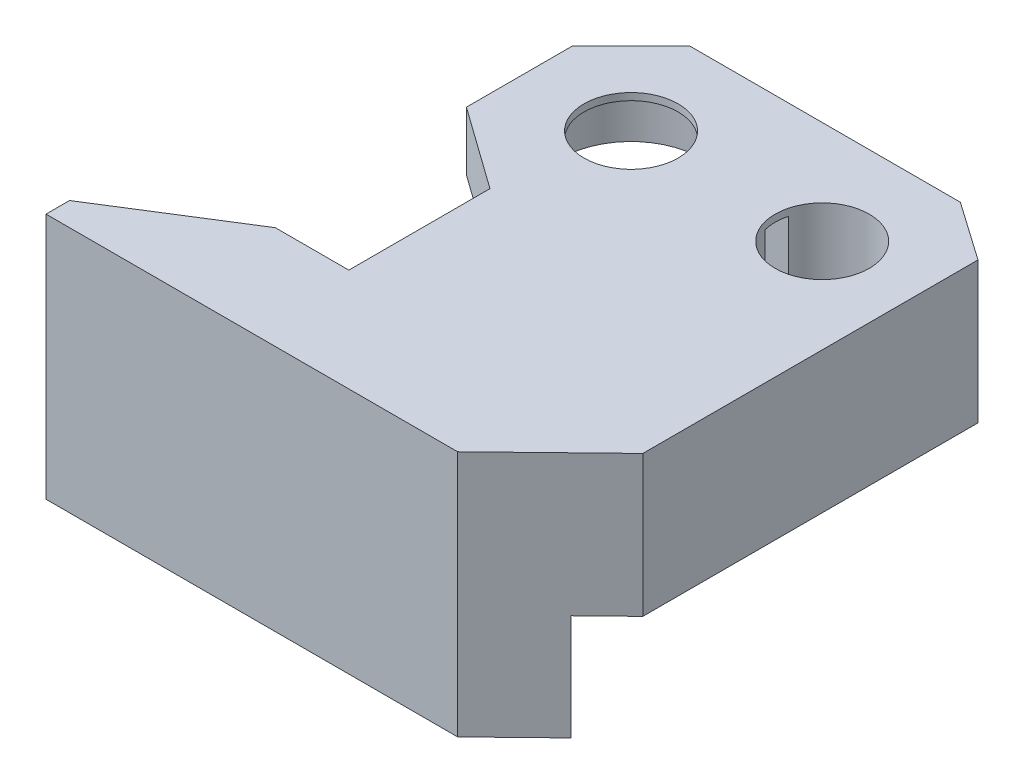
ISO-10303-21;
HEADER;
FILE_DESCRIPTION(('STEP AP214'),'2;1');
FILE_NAME('part.step','',(''),(''),'','','');
FILE_SCHEMA(('AUTOMOTIVE_DESIGN { 1 0 10303 214 1 1 1 1 }'));
ENDSEC;
DATA;
#1=APPLICATION_CONTEXT('core data for automotive mechanical design processes');
#2=APPLICATION_PROTOCOL_DEFINITION('international standard','automotive_design',2000,#1);
#3=PRODUCT_CONTEXT('',#1,'mechanical');
#4=PRODUCT('Part','Part','',(#3));
#5=PRODUCT_RELATED_PRODUCT_CATEGORY('part','',(#4));
#6=PRODUCT_DEFINITION_FORMATION('','',#4);
#7=PRODUCT_DEFINITION_CONTEXT('part definition',#1,'design');
#8=PRODUCT_DEFINITION('design','',#6,#7);
#9=PRODUCT_DEFINITION_SHAPE('','',#8);
#10=(LENGTH_UNIT() NAMED_UNIT(*) SI_UNIT(.MILLI.,.METRE.));
#11=(NAMED_UNIT(*) PLANE_ANGLE_UNIT() SI_UNIT($,.RADIAN.));
#12=(NAMED_UNIT(*) SI_UNIT($,.STERADIAN.) SOLID_ANGLE_UNIT());
#13=UNCERTAINTY_MEASURE_WITH_UNIT(LENGTH_MEASURE(1.E-05),#10,'distance_accuracy_value','');
#14=(GEOMETRIC_REPRESENTATION_CONTEXT(3) GLOBAL_UNCERTAINTY_ASSIGNED_CONTEXT((#13)) GLOBAL_UNIT_ASSIGNED_CONTEXT((#10,
#11,#12)) REPRESENTATION_CONTEXT('',''));
#15=CARTESIAN_POINT('',(0.,0.,0.));
#16=DIRECTION('',(0.,0.,1.));
#17=DIRECTION('',(1.,0.,0.));
#18=AXIS2_PLACEMENT_3D('',#15,#16,#17);
#19=CARTESIAN_POINT('',(16.25,5.,0.));
#20=DIRECTION('',(0.,-1.,0.));
#21=DIRECTION('',(0.,0.,-1.));
#22=AXIS2_PLACEMENT_3D('',#19,#20,#21);
#23=CYLINDRICAL_SURFACE('',#22,4.);
#24=CARTESIAN_POINT('',(16.25,5.,0.));
#25=DIRECTION('',(0.,1.,0.));
#26=DIRECTION('',(0.,0.,1.));
#27=AXIS2_PLACEMENT_3D('',#24,#25,#26);
#28=CIRCLE('',#27,4.);
#29=CARTESIAN_POINT('',(16.25,5.,4.));
#30=VERTEX_POINT('',#29);
#31=EDGE_CURVE('E290',#30,#30,#28,.T.);
#32=ORIENTED_EDGE('',*,*,#31,.T.);
#33=EDGE_LOOP('',(#32));
#34=FACE_BOUND('',#33,.T.);
#35=DIRECTION('',(0.,-1.,0.));
#36=VECTOR('',#35,1.);
#37=CARTESIAN_POINT('',(12.3770166537926,4.4,-1.));
#38=LINE('',#37,#36);
#39=CARTESIAN_POINT('',(12.3770166537926,4.4,-1.));
#40=VERTEX_POINT('',#39);
#41=CARTESIAN_POINT('',(12.3770166537926,-2.5,-1.));
#42=VERTEX_POINT('',#41);
#43=EDGE_CURVE('E209',#40,#42,#38,.T.);
#44=ORIENTED_EDGE('',*,*,#43,.T.);
#45=CARTESIAN_POINT('',(16.25,-2.5,0.));
#46=DIRECTION('',(0.,-1.,0.));
#47=DIRECTION('',(0.,0.,-1.));
#48=AXIS2_PLACEMENT_3D('',#45,#46,#47);
#49=CIRCLE('',#48,4.);
#50=CARTESIAN_POINT('',(12.3770166537926,-2.5,1.));
#51=VERTEX_POINT('',#50);
#52=EDGE_CURVE('E216',#42,#51,#49,.T.);
#53=ORIENTED_EDGE('',*,*,#52,.T.);
#54=DIRECTION('',(0.,-1.,0.));
#55=VECTOR('',#54,1.);
#56=CARTESIAN_POINT('',(12.3770166537926,4.4,1.));
#57=LINE('',#56,#55);
#58=CARTESIAN_POINT('',(12.3770166537926,4.4,1.));
#59=VERTEX_POINT('',#58);
#60=EDGE_CURVE('E198',#59,#51,#57,.T.);
#61=ORIENTED_EDGE('',*,*,#60,.F.);
#62=CARTESIAN_POINT('',(16.25,4.4,0.));
#63=DIRECTION('',(0.,1.,0.));
#64=DIRECTION('',(0.,0.,-1.));
#65=AXIS2_PLACEMENT_3D('',#62,#63,#64);
#66=CIRCLE('',#65,4.);
#67=EDGE_CURVE('E413',#40,#59,#66,.T.);
#68=ORIENTED_EDGE('',*,*,#67,.F.);
#69=EDGE_LOOP('',(#44,#53,#61,#68));
#70=FACE_BOUND('',#69,.T.);
#71=ADVANCED_FACE('F33',(#34,#70),#23,.F.);
#72=CARTESIAN_POINT('',(16.25,-2.5,0.));
#73=DIRECTION('',(0.,-1.,0.));
#74=DIRECTION('',(0.,0.,-1.));
#75=AXIS2_PLACEMENT_3D('',#72,#73,#74);
#76=PLANE('',#75);
#77=ORIENTED_EDGE('',*,*,#52,.F.);
#78=DIRECTION('',(-1.,0.,0.));
#79=VECTOR('',#78,1.);
#80=CARTESIAN_POINT('',(16.25,-2.5,-1.));
#81=LINE('',#80,#79);
#82=CARTESIAN_POINT('',(9.32179676972449,-2.5,-1.));
#83=VERTEX_POINT('',#82);
#84=EDGE_CURVE('E403',#42,#83,#81,.T.);
#85=ORIENTED_EDGE('',*,*,#84,.T.);
#86=CARTESIAN_POINT('',(16.25,-2.5,0.));
#87=DIRECTION('',(0.,-1.,0.));
#88=DIRECTION('',(0.,0.,-1.));
#89=AXIS2_PLACEMENT_3D('',#86,#87,#88);
#90=CIRCLE('',#89,7.);
#91=CARTESIAN_POINT('',(20.880064794363,-2.5,-5.25));
#92=VERTEX_POINT('',#91);
#93=EDGE_CURVE('E231',#83,#92,#90,.T.);
#94=ORIENTED_EDGE('',*,*,#93,.T.);
#95=DIRECTION('',(1.,0.,0.));
#96=VECTOR('',#95,1.);
#97=CARTESIAN_POINT('',(24.25,-2.5,-5.25));
#98=LINE('',#97,#96);
#99=CARTESIAN_POINT('',(20.75,-2.5,-5.25));
#100=VERTEX_POINT('',#99);
#101=EDGE_CURVE('E11',#100,#92,#98,.T.);
#102=ORIENTED_EDGE('',*,*,#101,.F.);
#103=DIRECTION('',(0.,0.,-1.));
#104=VECTOR('',#103,1.);
#105=CARTESIAN_POINT('',(20.75,-2.5,-5.25));
#106=LINE('',#105,#104);
#107=CARTESIAN_POINT('',(20.75,-2.5,5.3619026473818));
#108=VERTEX_POINT('',#107);
#109=EDGE_CURVE('E234',#108,#100,#106,.T.);
#110=ORIENTED_EDGE('',*,*,#109,.F.);
#111=CARTESIAN_POINT('',(9.32179676972449,-2.5,1.));
#112=VERTEX_POINT('',#111);
#113=EDGE_CURVE('E218',#108,#112,#90,.T.);
#114=ORIENTED_EDGE('',*,*,#113,.T.);
#115=DIRECTION('',(1.,0.,0.));
#116=VECTOR('',#115,1.);
#117=CARTESIAN_POINT('',(16.25,-2.5,1.));
#118=LINE('',#117,#116);
#119=EDGE_CURVE('E201',#112,#51,#118,.T.);
#120=ORIENTED_EDGE('',*,*,#119,.T.);
#121=EDGE_LOOP('',(#77,#85,#94,#102,#110,#114,#120));
#122=FACE_BOUND('',#121,.T.);
#123=ADVANCED_FACE('F214',(#122),#76,.T.);
#124=CARTESIAN_POINT('',(16.25,-2.5,0.));
#125=DIRECTION('',(0.,1.,0.));
#126=DIRECTION('',(0.,0.,1.));
#127=AXIS2_PLACEMENT_3D('',#124,#125,#126);
#128=CYLINDRICAL_SURFACE('',#127,7.);
#129=DIRECTION('',(0.,1.,0.));
#130=VECTOR('',#129,1.);
#131=CARTESIAN_POINT('',(9.32179676972449,-2.5,-1.));
#132=LINE('',#131,#130);
#133=CARTESIAN_POINT('',(9.32179676972449,0.,-1.));
#134=VERTEX_POINT('',#133);
#135=EDGE_CURVE('E219',#134,#83,#132,.F.);
#136=ORIENTED_EDGE('',*,*,#135,.F.);
#137=CARTESIAN_POINT('',(16.25,0.,0.));
#138=DIRECTION('',(0.,-1.,0.));
#139=DIRECTION('',(0.,0.,-1.));
#140=AXIS2_PLACEMENT_3D('',#137,#138,#139);
#141=CIRCLE('',#140,7.);
#142=CARTESIAN_POINT('',(20.880064794363,0.,-5.25));
#143=VERTEX_POINT('',#142);
#144=EDGE_CURVE('E223',#134,#143,#141,.T.);
#145=ORIENTED_EDGE('',*,*,#144,.T.);
#146=DIRECTION('',(0.,1.,0.));
#147=VECTOR('',#146,1.);
#148=CARTESIAN_POINT('',(20.880064794363,-2.5,-5.25));
#149=LINE('',#148,#147);
#150=EDGE_CURVE('E41',#143,#92,#149,.F.);
#151=ORIENTED_EDGE('',*,*,#150,.T.);
#152=ORIENTED_EDGE('',*,*,#93,.F.);
#153=EDGE_LOOP('',(#136,#145,#151,#152));
#154=FACE_BOUND('',#153,.T.);
#155=ADVANCED_FACE('F368',(#154),#128,.T.);
#156=DIRECTION('',(0.,1.,0.));
#157=VECTOR('',#156,1.);
#158=CARTESIAN_POINT('',(9.32179676972449,-2.5,1.));
#159=LINE('',#158,#157);
#160=CARTESIAN_POINT('',(9.32179676972449,0.,1.));
#161=VERTEX_POINT('',#160);
#162=EDGE_CURVE('E220',#112,#161,#159,.T.);
#163=ORIENTED_EDGE('',*,*,#162,.F.);
#164=ORIENTED_EDGE('',*,*,#113,.F.);
#165=DIRECTION('',(0.,1.,0.));
#166=VECTOR('',#165,1.);
#167=CARTESIAN_POINT('',(20.75,-2.5,5.3619026473818));
#168=LINE('',#167,#166);
#169=CARTESIAN_POINT('',(20.75,0.,5.3619026473818));
#170=VERTEX_POINT('',#169);
#171=EDGE_CURVE('E48',#108,#170,#168,.T.);
#172=ORIENTED_EDGE('',*,*,#171,.T.);
#173=EDGE_CURVE('E56',#170,#161,#141,.T.);
#174=ORIENTED_EDGE('',*,*,#173,.T.);
#175=EDGE_LOOP('',(#163,#164,#172,#174));
#176=FACE_BOUND('',#175,.T.);
#177=ADVANCED_FACE('F399',(#176),#128,.T.);
#178=CARTESIAN_POINT('',(0.,5.,0.));
#179=DIRECTION('',(0.,-1.,0.));
#180=DIRECTION('',(0.,0.,-1.));
#181=AXIS2_PLACEMENT_3D('',#178,#179,#180);
#182=CYLINDRICAL_SURFACE('',#181,4.);
#183=CARTESIAN_POINT('',(0.,5.,0.));
#184=DIRECTION('',(0.,1.,0.));
#185=DIRECTION('',(0.,0.,1.));
#186=AXIS2_PLACEMENT_3D('',#183,#184,#185);
#187=CIRCLE('',#186,4.);
#188=CARTESIAN_POINT('',(0.,5.,4.));
#189=VERTEX_POINT('',#188);
#190=EDGE_CURVE('E293',#189,#189,#187,.T.);
#191=ORIENTED_EDGE('',*,*,#190,.T.);
#192=EDGE_LOOP('',(#191));
#193=FACE_BOUND('',#192,.T.);
#194=CARTESIAN_POINT('',(0.,4.4,0.));
#195=DIRECTION('',(0.,-1.,0.));
#196=DIRECTION('',(0.,0.,-1.));
#197=AXIS2_PLACEMENT_3D('',#194,#195,#196);
#198=CIRCLE('',#197,4.);
#199=CARTESIAN_POINT('',(0.,4.4,-4.));
#200=VERTEX_POINT('',#199);
#201=EDGE_CURVE('E224',#200,#200,#198,.T.);
#202=ORIENTED_EDGE('',*,*,#201,.T.);
#203=EDGE_LOOP('',(#202));
#204=FACE_BOUND('',#203,.T.);
#205=ADVANCED_FACE('F452',(#193,#204),#182,.F.);
#206=CARTESIAN_POINT('',(0.,0.,0.));
#207=DIRECTION('',(0.,1.,0.));
#208=DIRECTION('',(0.,0.,1.));
#209=AXIS2_PLACEMENT_3D('',#206,#207,#208);
#210=PLANE('',#209);
#211=CARTESIAN_POINT('',(0.,0.,0.));
#212=DIRECTION('',(0.,-1.,0.));
#213=DIRECTION('',(0.,0.,-1.));
#214=AXIS2_PLACEMENT_3D('',#211,#212,#213);
#215=CIRCLE('',#214,5.96815667340306);
#216=CARTESIAN_POINT('',(5.88378229358339,0.,1.));
#217=VERTEX_POINT('',#216);
#218=CARTESIAN_POINT('',(5.88378229358339,0.,-1.));
#219=VERTEX_POINT('',#218);
#220=EDGE_CURVE('E405',#217,#219,#215,.T.);
#221=ORIENTED_EDGE('',*,*,#220,.F.);
#222=DIRECTION('',(-1.,0.,0.));
#223=VECTOR('',#222,1.);
#224=CARTESIAN_POINT('',(5.88378229358339,0.,1.));
#225=LINE('',#224,#223);
#226=EDGE_CURVE('E410',#161,#217,#225,.T.);
#227=ORIENTED_EDGE('',*,*,#226,.F.);
#228=ORIENTED_EDGE('',*,*,#173,.F.);
#229=DIRECTION('',(0.,0.,-1.));
#230=VECTOR('',#229,1.);
#231=CARTESIAN_POINT('',(20.75,0.,-5.25));
#232=LINE('',#231,#230);
#233=CARTESIAN_POINT('',(20.75,0.,22.25));
#234=VERTEX_POINT('',#233);
#235=EDGE_CURVE('E255',#234,#170,#232,.T.);
#236=ORIENTED_EDGE('',*,*,#235,.F.);
#237=DIRECTION('',(1.,0.,0.));
#238=VECTOR('',#237,1.);
#239=CARTESIAN_POINT('',(20.75,0.,22.25));
#240=LINE('',#239,#238);
#241=CARTESIAN_POINT('',(-1.74999999999999,0.,22.25));
#242=VERTEX_POINT('',#241);
#243=EDGE_CURVE('E276',#242,#234,#240,.T.);
#244=ORIENTED_EDGE('',*,*,#243,.F.);
#245=DIRECTION('',(0.,0.,1.));
#246=VECTOR('',#245,1.);
#247=CARTESIAN_POINT('',(-1.74999999999999,0.,22.25));
#248=LINE('',#247,#246);
#249=CARTESIAN_POINT('',(-1.74999999999999,0.,10.25));
#250=VERTEX_POINT('',#249);
#251=EDGE_CURVE('E330',#250,#242,#248,.T.);
#252=ORIENTED_EDGE('',*,*,#251,.F.);
#253=DIRECTION('',(0.813733471206735,0.,0.581238193719096));
#254=VECTOR('',#253,1.);
#255=CARTESIAN_POINT('',(-1.74999999999999,0.,10.25));
#256=LINE('',#255,#254);
#257=CARTESIAN_POINT('',(-8.75,0.,5.25));
#258=VERTEX_POINT('',#257);
#259=EDGE_CURVE('E328',#258,#250,#256,.T.);
#260=ORIENTED_EDGE('',*,*,#259,.F.);
#261=DIRECTION('',(0.,0.,1.));
#262=VECTOR('',#261,1.);
#263=CARTESIAN_POINT('',(-8.75,0.,5.25));
#264=LINE('',#263,#262);
#265=CARTESIAN_POINT('',(-8.75,0.,-3.75));
#266=VERTEX_POINT('',#265);
#267=EDGE_CURVE('E326',#266,#258,#264,.T.);
#268=ORIENTED_EDGE('',*,*,#267,.F.);
#269=DIRECTION('',(-0.707106781186547,0.,0.707106781186548));
#270=VECTOR('',#269,1.);
#271=CARTESIAN_POINT('',(-8.75,0.,-3.75));
#272=LINE('',#271,#270);
#273=CARTESIAN_POINT('',(-3.75,0.,-8.75));
#274=VERTEX_POINT('',#273);
#275=EDGE_CURVE('E296',#274,#266,#272,.T.);
#276=ORIENTED_EDGE('',*,*,#275,.F.);
#277=DIRECTION('',(-1.,0.,0.));
#278=VECTOR('',#277,1.);
#279=CARTESIAN_POINT('',(-3.75,0.,-8.75));
#280=LINE('',#279,#278);
#281=CARTESIAN_POINT('',(19.25,0.,-8.75));
#282=VERTEX_POINT('',#281);
#283=EDGE_CURVE('E301',#282,#274,#280,.T.);
#284=ORIENTED_EDGE('',*,*,#283,.F.);
#285=DIRECTION('',(-0.819231920519041,0.,-0.573462344363328));
#286=VECTOR('',#285,1.);
#287=CARTESIAN_POINT('',(19.25,0.,-8.75));
#288=LINE('',#287,#286);
#289=CARTESIAN_POINT('',(24.25,0.,-5.25));
#290=VERTEX_POINT('',#289);
#291=EDGE_CURVE('E333',#290,#282,#288,.T.);
#292=ORIENTED_EDGE('',*,*,#291,.F.);
#293=DIRECTION('',(1.,0.,0.));
#294=VECTOR('',#293,1.);
#295=CARTESIAN_POINT('',(24.25,0.,-5.25));
#296=LINE('',#295,#294);
#297=EDGE_CURVE('E260',#143,#290,#296,.T.);
#298=ORIENTED_EDGE('',*,*,#297,.F.);
#299=ORIENTED_EDGE('',*,*,#144,.F.);
#300=DIRECTION('',(1.,0.,0.));
#301=VECTOR('',#300,1.);
#302=CARTESIAN_POINT('',(5.88378229358339,0.,-1.));
#303=LINE('',#302,#301);
#304=EDGE_CURVE('E419',#219,#134,#303,.T.);
#305=ORIENTED_EDGE('',*,*,#304,.F.);
#306=EDGE_LOOP('',(#221,#227,#228,#236,#244,#252,#260,#268,#276,#284,#292,#298,#299,#305));
#307=FACE_BOUND('',#306,.T.);
#308=ADVANCED_FACE('F377',(#307),#210,.F.);
#309=CARTESIAN_POINT('',(0.,5.,0.));
#310=DIRECTION('',(0.,1.,0.));
#311=DIRECTION('',(0.,0.,1.));
#312=AXIS2_PLACEMENT_3D('',#309,#310,#311);
#313=PLANE('',#312);
#314=ORIENTED_EDGE('',*,*,#190,.F.);
#315=EDGE_LOOP('',(#314));
#316=FACE_BOUND('',#315,.T.);
#317=DIRECTION('',(-0.707106781186547,0.,0.707106781186548));
#318=VECTOR('',#317,1.);
#319=CARTESIAN_POINT('',(-8.75,5.,-3.75));
#320=LINE('',#319,#318);
#321=CARTESIAN_POINT('',(-3.75,5.,-8.75));
#322=VERTEX_POINT('',#321);
#323=CARTESIAN_POINT('',(-8.75,5.,-3.75));
#324=VERTEX_POINT('',#323);
#325=EDGE_CURVE('E297',#322,#324,#320,.T.);
#326=ORIENTED_EDGE('',*,*,#325,.T.);
#327=DIRECTION('',(0.,0.,1.));
#328=VECTOR('',#327,1.);
#329=CARTESIAN_POINT('',(-8.75,5.,5.25));
#330=LINE('',#329,#328);
#331=CARTESIAN_POINT('',(-8.75,5.,5.25));
#332=VERTEX_POINT('',#331);
#333=EDGE_CURVE('E300',#324,#332,#330,.T.);
#334=ORIENTED_EDGE('',*,*,#333,.T.);
#335=DIRECTION('',(0.813733471206735,0.,0.581238193719096));
#336=VECTOR('',#335,1.);
#337=CARTESIAN_POINT('',(-1.74999999999999,5.,10.25));
#338=LINE('',#337,#336);
#339=CARTESIAN_POINT('',(-1.74999999999999,5.,10.25));
#340=VERTEX_POINT('',#339);
#341=EDGE_CURVE('E303',#332,#340,#338,.T.);
#342=ORIENTED_EDGE('',*,*,#341,.T.);
#343=DIRECTION('',(0.,0.,1.));
#344=VECTOR('',#343,1.);
#345=CARTESIAN_POINT('',(-1.74999999999999,5.,22.25));
#346=LINE('',#345,#344);
#347=CARTESIAN_POINT('',(-1.74999999999999,5.,22.25));
#348=VERTEX_POINT('',#347);
#349=EDGE_CURVE('E305',#340,#348,#346,.T.);
#350=ORIENTED_EDGE('',*,*,#349,.T.);
#351=DIRECTION('',(-1.,0.,0.));
#352=VECTOR('',#351,1.);
#353=CARTESIAN_POINT('',(-7.99999999999999,5.,22.25));
#354=LINE('',#353,#352);
#355=CARTESIAN_POINT('',(-7.99999999999999,5.,22.25));
#356=VERTEX_POINT('',#355);
#357=EDGE_CURVE('E307',#348,#356,#354,.T.);
#358=ORIENTED_EDGE('',*,*,#357,.T.);
#359=DIRECTION('',(-0.846889988853068,0.,0.531768132535648));
#360=VECTOR('',#359,1.);
#361=CARTESIAN_POINT('',(-18.75,5.,29.));
#362=LINE('',#361,#360);
#363=CARTESIAN_POINT('',(-18.75,5.,29.));
#364=VERTEX_POINT('',#363);
#365=EDGE_CURVE('E309',#356,#364,#362,.T.);
#366=ORIENTED_EDGE('',*,*,#365,.T.);
#367=DIRECTION('',(0.,0.,1.));
#368=VECTOR('',#367,1.);
#369=CARTESIAN_POINT('',(-18.75,5.,31.));
#370=LINE('',#369,#368);
#371=CARTESIAN_POINT('',(-18.75,5.,31.));
#372=VERTEX_POINT('',#371);
#373=EDGE_CURVE('E311',#364,#372,#370,.T.);
#374=ORIENTED_EDGE('',*,*,#373,.T.);
#375=DIRECTION('',(1.,0.,0.));
#376=VECTOR('',#375,1.);
#377=CARTESIAN_POINT('',(16.25,5.,31.));
#378=LINE('',#377,#376);
#379=CARTESIAN_POINT('',(16.25,5.,31.));
#380=VERTEX_POINT('',#379);
#381=EDGE_CURVE('E313',#372,#380,#378,.T.);
#382=ORIENTED_EDGE('',*,*,#381,.T.);
#383=DIRECTION('',(0.718240222789173,0.,-0.695795215827012));
#384=VECTOR('',#383,1.);
#385=CARTESIAN_POINT('',(24.25,5.,23.25));
#386=LINE('',#385,#384);
#387=CARTESIAN_POINT('',(24.25,5.,23.25));
#388=VERTEX_POINT('',#387);
#389=EDGE_CURVE('E315',#380,#388,#386,.T.);
#390=ORIENTED_EDGE('',*,*,#389,.T.);
#391=DIRECTION('',(0.,0.,-1.));
#392=VECTOR('',#391,1.);
#393=CARTESIAN_POINT('',(24.25,5.,-5.25));
#394=LINE('',#393,#392);
#395=CARTESIAN_POINT('',(24.25,5.,-5.25));
#396=VERTEX_POINT('',#395);
#397=EDGE_CURVE('E317',#388,#396,#394,.T.);
#398=ORIENTED_EDGE('',*,*,#397,.T.);
#399=DIRECTION('',(-0.819231920519041,0.,-0.573462344363328));
#400=VECTOR('',#399,1.);
#401=CARTESIAN_POINT('',(19.25,5.,-8.75));
#402=LINE('',#401,#400);
#403=CARTESIAN_POINT('',(19.25,5.,-8.75));
#404=VERTEX_POINT('',#403);
#405=EDGE_CURVE('E319',#396,#404,#402,.T.);
#406=ORIENTED_EDGE('',*,*,#405,.T.);
#407=DIRECTION('',(-1.,0.,0.));
#408=VECTOR('',#407,1.);
#409=CARTESIAN_POINT('',(-3.75,5.,-8.75));
#410=LINE('',#409,#408);
#411=EDGE_CURVE('E321',#404,#322,#410,.T.);
#412=ORIENTED_EDGE('',*,*,#411,.T.);
#413=EDGE_LOOP('',(#326,#334,#342,#350,#358,#366,#374,#382,#390,#398,#406,#412));
#414=FACE_BOUND('',#413,.T.);
#415=ORIENTED_EDGE('',*,*,#31,.F.);
#416=EDGE_LOOP('',(#415));
#417=FACE_BOUND('',#416,.T.);
#418=ADVANCED_FACE('F456',(#316,#414,#417),#313,.T.);
#419=CARTESIAN_POINT('',(-8.75,5.,-3.75));
#420=DIRECTION('',(0.707106781186548,0.,0.707106781186547));
#421=DIRECTION('',(0.707106781186547,0.,-0.707106781186548));
#422=AXIS2_PLACEMENT_3D('',#419,#420,#421);
#423=PLANE('',#422);
#424=ORIENTED_EDGE('',*,*,#275,.T.);
#425=DIRECTION('',(0.,-1.,0.));
#426=VECTOR('',#425,1.);
#427=CARTESIAN_POINT('',(-8.75,5.,-3.75));
#428=LINE('',#427,#426);
#429=EDGE_CURVE('E279',#324,#266,#428,.T.);
#430=ORIENTED_EDGE('',*,*,#429,.F.);
#431=ORIENTED_EDGE('',*,*,#325,.F.);
#432=DIRECTION('',(0.,-1.,0.));
#433=VECTOR('',#432,1.);
#434=CARTESIAN_POINT('',(-3.75,5.,-8.75));
#435=LINE('',#434,#433);
#436=EDGE_CURVE('E323',#322,#274,#435,.T.);
#437=ORIENTED_EDGE('',*,*,#436,.T.);
#438=EDGE_LOOP('',(#424,#430,#431,#437));
#439=FACE_BOUND('',#438,.T.);
#440=ADVANCED_FACE('F35',(#439),#423,.F.);
#441=CARTESIAN_POINT('',(-8.75,5.,5.25));
#442=DIRECTION('',(1.,0.,0.));
#443=DIRECTION('',(0.,0.,-1.));
#444=AXIS2_PLACEMENT_3D('',#441,#442,#443);
#445=PLANE('',#444);
#446=ORIENTED_EDGE('',*,*,#267,.T.);
#447=DIRECTION('',(0.,-1.,0.));
#448=VECTOR('',#447,1.);
#449=CARTESIAN_POINT('',(-8.75,5.,5.25));
#450=LINE('',#449,#448);
#451=EDGE_CURVE('E360',#332,#258,#450,.T.);
#452=ORIENTED_EDGE('',*,*,#451,.F.);
#453=ORIENTED_EDGE('',*,*,#333,.F.);
#454=ORIENTED_EDGE('',*,*,#429,.T.);
#455=EDGE_LOOP('',(#446,#452,#453,#454));
#456=FACE_BOUND('',#455,.T.);
#457=ADVANCED_FACE('F497',(#456),#445,.F.);
#458=CARTESIAN_POINT('',(-1.74999999999999,5.,10.25));
#459=DIRECTION('',(0.581238193719096,0.,-0.813733471206735));
#460=DIRECTION('',(-0.813733471206735,0.,-0.581238193719096));
#461=AXIS2_PLACEMENT_3D('',#458,#459,#460);
#462=PLANE('',#461);
#463=ORIENTED_EDGE('',*,*,#259,.T.);
#464=DIRECTION('',(0.,-1.,0.));
#465=VECTOR('',#464,1.);
#466=CARTESIAN_POINT('',(-1.74999999999999,5.,10.25));
#467=LINE('',#466,#465);
#468=EDGE_CURVE('E357',#340,#250,#467,.T.);
#469=ORIENTED_EDGE('',*,*,#468,.F.);
#470=ORIENTED_EDGE('',*,*,#341,.F.);
#471=ORIENTED_EDGE('',*,*,#451,.T.);
#472=EDGE_LOOP('',(#463,#469,#470,#471));
#473=FACE_BOUND('',#472,.T.);
#474=ADVANCED_FACE('F494',(#473),#462,.F.);
#475=CARTESIAN_POINT('',(-1.74999999999999,5.,22.25));
#476=DIRECTION('',(1.,0.,0.));
#477=DIRECTION('',(0.,0.,-1.));
#478=AXIS2_PLACEMENT_3D('',#475,#476,#477);
#479=PLANE('',#478);
#480=ORIENTED_EDGE('',*,*,#251,.T.);
#481=DIRECTION('',(0.,-1.,0.));
#482=VECTOR('',#481,1.);
#483=CARTESIAN_POINT('',(-1.74999999999999,5.,22.25));
#484=LINE('',#483,#482);
#485=EDGE_CURVE('E354',#348,#242,#484,.T.);
#486=ORIENTED_EDGE('',*,*,#485,.F.);
#487=ORIENTED_EDGE('',*,*,#349,.F.);
#488=ORIENTED_EDGE('',*,*,#468,.T.);
#489=EDGE_LOOP('',(#480,#486,#487,#488));
#490=FACE_BOUND('',#489,.T.);
#491=ADVANCED_FACE('F490',(#490),#479,.F.);
#492=CARTESIAN_POINT('',(-7.99999999999999,5.,22.25));
#493=DIRECTION('',(0.,0.,1.));
#494=DIRECTION('',(1.,0.,0.));
#495=AXIS2_PLACEMENT_3D('',#492,#493,#494);
#496=PLANE('',#495);
#497=ORIENTED_EDGE('',*,*,#485,.T.);
#498=ORIENTED_EDGE('',*,*,#243,.T.);
#499=DIRECTION('',(0.,1.,0.));
#500=VECTOR('',#499,1.);
#501=CARTESIAN_POINT('',(20.75,-7.,22.25));
#502=LINE('',#501,#500);
#503=CARTESIAN_POINT('',(20.75,-7.,22.25));
#504=VERTEX_POINT('',#503);
#505=EDGE_CURVE('E287',#504,#234,#502,.T.);
#506=ORIENTED_EDGE('',*,*,#505,.F.);
#507=DIRECTION('',(1.,0.,0.));
#508=VECTOR('',#507,1.);
#509=CARTESIAN_POINT('',(20.75,-7.,22.25));
#510=LINE('',#509,#508);
#511=CARTESIAN_POINT('',(-8.,-7.,22.25));
#512=VERTEX_POINT('',#511);
#513=EDGE_CURVE('E266',#512,#504,#510,.T.);
#514=ORIENTED_EDGE('',*,*,#513,.F.);
#515=DIRECTION('',(0.,-1.,0.));
#516=VECTOR('',#515,1.);
#517=CARTESIAN_POINT('',(-7.99999999999999,5.,22.25));
#518=LINE('',#517,#516);
#519=EDGE_CURVE('E352',#356,#512,#518,.T.);
#520=ORIENTED_EDGE('',*,*,#519,.F.);
#521=ORIENTED_EDGE('',*,*,#357,.F.);
#522=EDGE_LOOP('',(#497,#498,#506,#514,#520,#521));
#523=FACE_BOUND('',#522,.T.);
#524=ADVANCED_FACE('F486',(#523),#496,.F.);
#525=CARTESIAN_POINT('',(-18.75,5.,29.));
#526=DIRECTION('',(0.531768132535648,0.,0.846889988853068));
#527=DIRECTION('',(0.846889988853068,0.,-0.531768132535648));
#528=AXIS2_PLACEMENT_3D('',#525,#526,#527);
#529=PLANE('',#528);
#530=DIRECTION('',(0.846889988853068,0.,-0.531768132535648));
#531=VECTOR('',#530,1.);
#532=CARTESIAN_POINT('',(-18.75,-16.,29.));
#533=LINE('',#532,#531);
#534=CARTESIAN_POINT('',(-18.75,-16.,29.));
#535=VERTEX_POINT('',#534);
#536=CARTESIAN_POINT('',(-14.3703703703704,-16.,26.25));
#537=VERTEX_POINT('',#536);
#538=EDGE_CURVE('E236',#535,#537,#533,.T.);
#539=ORIENTED_EDGE('',*,*,#538,.F.);
#540=DIRECTION('',(0.,-1.,0.));
#541=VECTOR('',#540,1.);
#542=CARTESIAN_POINT('',(-18.75,5.,29.));
#543=LINE('',#542,#541);
#544=EDGE_CURVE('E350',#364,#535,#543,.T.);
#545=ORIENTED_EDGE('',*,*,#544,.F.);
#546=ORIENTED_EDGE('',*,*,#365,.F.);
#547=ORIENTED_EDGE('',*,*,#519,.T.);
#548=DIRECTION('',(0.846889988853068,0.,-0.531768132535648));
#549=VECTOR('',#548,1.);
#550=CARTESIAN_POINT('',(-8.,-7.,22.25));
#551=LINE('',#550,#549);
#552=CARTESIAN_POINT('',(-14.3703703703704,-7.,26.25));
#553=VERTEX_POINT('',#552);
#554=EDGE_CURVE('E263',#553,#512,#551,.T.);
#555=ORIENTED_EDGE('',*,*,#554,.F.);
#556=DIRECTION('',(0.,1.,0.));
#557=VECTOR('',#556,1.);
#558=CARTESIAN_POINT('',(-14.3703703703704,-16.,26.25));
#559=LINE('',#558,#557);
#560=EDGE_CURVE('E253',#537,#553,#559,.T.);
#561=ORIENTED_EDGE('',*,*,#560,.F.);
#562=EDGE_LOOP('',(#539,#545,#546,#547,#555,#561));
#563=FACE_BOUND('',#562,.T.);
#564=ADVANCED_FACE('F482',(#563),#529,.F.);
#565=CARTESIAN_POINT('',(-18.75,5.,31.));
#566=DIRECTION('',(1.,0.,0.));
#567=DIRECTION('',(0.,0.,-1.));
#568=AXIS2_PLACEMENT_3D('',#565,#566,#567);
#569=PLANE('',#568);
#570=ORIENTED_EDGE('',*,*,#544,.T.);
#571=DIRECTION('',(0.,0.,-1.));
#572=VECTOR('',#571,1.);
#573=CARTESIAN_POINT('',(-18.75,-16.,31.));
#574=LINE('',#573,#572);
#575=CARTESIAN_POINT('',(-18.75,-16.,31.));
#576=VERTEX_POINT('',#575);
#577=EDGE_CURVE('E247',#576,#535,#574,.T.);
#578=ORIENTED_EDGE('',*,*,#577,.F.);
#579=DIRECTION('',(0.,-1.,0.));
#580=VECTOR('',#579,1.);
#581=CARTESIAN_POINT('',(-18.75,5.,31.));
#582=LINE('',#581,#580);
#583=EDGE_CURVE('E348',#372,#576,#582,.T.);
#584=ORIENTED_EDGE('',*,*,#583,.F.);
#585=ORIENTED_EDGE('',*,*,#373,.F.);
#586=EDGE_LOOP('',(#570,#578,#584,#585));
#587=FACE_BOUND('',#586,.T.);
#588=ADVANCED_FACE('F478',(#587),#569,.F.);
#589=CARTESIAN_POINT('',(16.25,5.,31.));
#590=DIRECTION('',(0.,0.,-1.));
#591=DIRECTION('',(-1.,0.,0.));
#592=AXIS2_PLACEMENT_3D('',#589,#590,#591);
#593=PLANE('',#592);
#594=ORIENTED_EDGE('',*,*,#583,.T.);
#595=DIRECTION('',(-1.,0.,0.));
#596=VECTOR('',#595,1.);
#597=CARTESIAN_POINT('',(16.25,-16.,31.));
#598=LINE('',#597,#596);
#599=CARTESIAN_POINT('',(16.25,-16.,31.));
#600=VERTEX_POINT('',#599);
#601=EDGE_CURVE('E244',#600,#576,#598,.T.);
#602=ORIENTED_EDGE('',*,*,#601,.F.);
#603=DIRECTION('',(0.,-1.,0.));
#604=VECTOR('',#603,1.);
#605=CARTESIAN_POINT('',(16.25,5.,31.));
#606=LINE('',#605,#604);
#607=EDGE_CURVE('E346',#380,#600,#606,.T.);
#608=ORIENTED_EDGE('',*,*,#607,.F.);
#609=ORIENTED_EDGE('',*,*,#381,.F.);
#610=EDGE_LOOP('',(#594,#602,#608,#609));
#611=FACE_BOUND('',#610,.T.);
#612=ADVANCED_FACE('F474',(#611),#593,.F.);
#613=CARTESIAN_POINT('',(24.25,5.,23.25));
#614=DIRECTION('',(-0.695795215827012,0.,-0.718240222789173));
#615=DIRECTION('',(-0.718240222789173,0.,0.695795215827012));
#616=AXIS2_PLACEMENT_3D('',#613,#614,#615);
#617=PLANE('',#616);
#618=ORIENTED_EDGE('',*,*,#607,.T.);
#619=DIRECTION('',(-0.718240222789173,0.,0.695795215827012));
#620=VECTOR('',#619,1.);
#621=CARTESIAN_POINT('',(21.1532258064516,-16.,26.25));
#622=LINE('',#621,#620);
#623=CARTESIAN_POINT('',(21.1532258064516,-16.,26.25));
#624=VERTEX_POINT('',#623);
#625=EDGE_CURVE('E241',#624,#600,#622,.T.);
#626=ORIENTED_EDGE('',*,*,#625,.F.);
#627=DIRECTION('',(0.,1.,0.));
#628=VECTOR('',#627,1.);
#629=CARTESIAN_POINT('',(21.1532258064516,-16.,26.25));
#630=LINE('',#629,#628);
#631=CARTESIAN_POINT('',(21.1532258064516,-7.,26.25));
#632=VERTEX_POINT('',#631);
#633=EDGE_CURVE('E250',#624,#632,#630,.T.);
#634=ORIENTED_EDGE('',*,*,#633,.T.);
#635=DIRECTION('',(-0.718240222789173,0.,0.695795215827013));
#636=VECTOR('',#635,1.);
#637=CARTESIAN_POINT('',(21.1532258064516,-7.,26.25));
#638=LINE('',#637,#636);
#639=CARTESIAN_POINT('',(24.25,-7.,23.25));
#640=VERTEX_POINT('',#639);
#641=EDGE_CURVE('E256',#640,#632,#638,.T.);
#642=ORIENTED_EDGE('',*,*,#641,.F.);
#643=DIRECTION('',(0.,-1.,0.));
#644=VECTOR('',#643,1.);
#645=CARTESIAN_POINT('',(24.25,5.,23.25));
#646=LINE('',#645,#644);
#647=EDGE_CURVE('E344',#388,#640,#646,.T.);
#648=ORIENTED_EDGE('',*,*,#647,.F.);
#649=ORIENTED_EDGE('',*,*,#389,.F.);
#650=EDGE_LOOP('',(#618,#626,#634,#642,#648,#649));
#651=FACE_BOUND('',#650,.T.);
#652=ADVANCED_FACE('F471',(#651),#617,.F.);
#653=CARTESIAN_POINT('',(24.25,5.,-5.25));
#654=DIRECTION('',(-1.,0.,0.));
#655=DIRECTION('',(0.,0.,1.));
#656=AXIS2_PLACEMENT_3D('',#653,#654,#655);
#657=PLANE('',#656);
#658=ORIENTED_EDGE('',*,*,#647,.T.);
#659=DIRECTION('',(0.,0.,1.));
#660=VECTOR('',#659,1.);
#661=CARTESIAN_POINT('',(24.25,-7.,23.25));
#662=LINE('',#661,#660);
#663=CARTESIAN_POINT('',(24.25,-7.,-5.25));
#664=VERTEX_POINT('',#663);
#665=EDGE_CURVE('E272',#664,#640,#662,.T.);
#666=ORIENTED_EDGE('',*,*,#665,.F.);
#667=DIRECTION('',(0.,1.,0.));
#668=VECTOR('',#667,1.);
#669=CARTESIAN_POINT('',(24.25,-7.,-5.25));
#670=LINE('',#669,#668);
#671=EDGE_CURVE('E275',#664,#290,#670,.T.);
#672=ORIENTED_EDGE('',*,*,#671,.T.);
#673=DIRECTION('',(0.,-1.,0.));
#674=VECTOR('',#673,1.);
#675=CARTESIAN_POINT('',(24.25,5.,-5.25));
#676=LINE('',#675,#674);
#677=EDGE_CURVE('E341',#396,#290,#676,.T.);
#678=ORIENTED_EDGE('',*,*,#677,.F.);
#679=ORIENTED_EDGE('',*,*,#397,.F.);
#680=EDGE_LOOP('',(#658,#666,#672,#678,#679));
#681=FACE_BOUND('',#680,.T.);
#682=ADVANCED_FACE('F386',(#681),#657,.F.);
#683=CARTESIAN_POINT('',(19.25,5.,-8.75));
#684=DIRECTION('',(-0.573462344363328,0.,0.819231920519041));
#685=DIRECTION('',(0.819231920519041,0.,0.573462344363328));
#686=AXIS2_PLACEMENT_3D('',#683,#684,#685);
#687=PLANE('',#686);
#688=ORIENTED_EDGE('',*,*,#291,.T.);
#689=DIRECTION('',(0.,-1.,0.));
#690=VECTOR('',#689,1.);
#691=CARTESIAN_POINT('',(19.25,5.,-8.75));
#692=LINE('',#691,#690);
#693=EDGE_CURVE('E338',#404,#282,#692,.T.);
#694=ORIENTED_EDGE('',*,*,#693,.F.);
#695=ORIENTED_EDGE('',*,*,#405,.F.);
#696=ORIENTED_EDGE('',*,*,#677,.T.);
#697=EDGE_LOOP('',(#688,#694,#695,#696));
#698=FACE_BOUND('',#697,.T.);
#699=ADVANCED_FACE('F465',(#698),#687,.F.);
#700=CARTESIAN_POINT('',(-3.75,5.,-8.75));
#701=DIRECTION('',(0.,0.,1.));
#702=DIRECTION('',(1.,0.,0.));
#703=AXIS2_PLACEMENT_3D('',#700,#701,#702);
#704=PLANE('',#703);
#705=ORIENTED_EDGE('',*,*,#283,.T.);
#706=ORIENTED_EDGE('',*,*,#436,.F.);
#707=ORIENTED_EDGE('',*,*,#411,.F.);
#708=ORIENTED_EDGE('',*,*,#693,.T.);
#709=EDGE_LOOP('',(#705,#706,#707,#708));
#710=FACE_BOUND('',#709,.T.);
#711=ADVANCED_FACE('F462',(#710),#704,.F.);
#712=CARTESIAN_POINT('',(20.75,-7.,-5.25));
#713=DIRECTION('',(1.,0.,0.));
#714=DIRECTION('',(0.,0.,-1.));
#715=AXIS2_PLACEMENT_3D('',#712,#713,#714);
#716=PLANE('',#715);
#717=ORIENTED_EDGE('',*,*,#171,.F.);
#718=ORIENTED_EDGE('',*,*,#109,.T.);
#719=DIRECTION('',(0.,1.,0.));
#720=VECTOR('',#719,1.);
#721=CARTESIAN_POINT('',(20.75,-7.,-5.25));
#722=LINE('',#721,#720);
#723=CARTESIAN_POINT('',(20.75,-7.,-5.25));
#724=VERTEX_POINT('',#723);
#725=EDGE_CURVE('E284',#724,#100,#722,.T.);
#726=ORIENTED_EDGE('',*,*,#725,.F.);
#727=DIRECTION('',(0.,0.,-1.));
#728=VECTOR('',#727,1.);
#729=CARTESIAN_POINT('',(20.75,-7.,-5.25));
#730=LINE('',#729,#728);
#731=EDGE_CURVE('E268',#504,#724,#730,.T.);
#732=ORIENTED_EDGE('',*,*,#731,.F.);
#733=ORIENTED_EDGE('',*,*,#505,.T.);
#734=ORIENTED_EDGE('',*,*,#235,.T.);
#735=EDGE_LOOP('',(#717,#718,#726,#732,#733,#734));
#736=FACE_BOUND('',#735,.T.);
#737=ADVANCED_FACE('F397',(#736),#716,.F.);
#738=CARTESIAN_POINT('',(24.25,-7.,-5.25));
#739=DIRECTION('',(0.,0.,1.));
#740=DIRECTION('',(1.,0.,0.));
#741=AXIS2_PLACEMENT_3D('',#738,#739,#740);
#742=PLANE('',#741);
#743=ORIENTED_EDGE('',*,*,#725,.T.);
#744=ORIENTED_EDGE('',*,*,#101,.T.);
#745=ORIENTED_EDGE('',*,*,#150,.F.);
#746=ORIENTED_EDGE('',*,*,#297,.T.);
#747=ORIENTED_EDGE('',*,*,#671,.F.);
#748=DIRECTION('',(1.,0.,0.));
#749=VECTOR('',#748,1.);
#750=CARTESIAN_POINT('',(24.25,-7.,-5.25));
#751=LINE('',#750,#749);
#752=EDGE_CURVE('E270',#724,#664,#751,.T.);
#753=ORIENTED_EDGE('',*,*,#752,.F.);
#754=EDGE_LOOP('',(#743,#744,#745,#746,#747,#753));
#755=FACE_BOUND('',#754,.T.);
#756=ADVANCED_FACE('F372',(#755),#742,.F.);
#757=CARTESIAN_POINT('',(0.,-7.,0.));
#758=DIRECTION('',(0.,1.,0.));
#759=DIRECTION('',(0.,0.,1.));
#760=AXIS2_PLACEMENT_3D('',#757,#758,#759);
#761=PLANE('',#760);
#762=ORIENTED_EDGE('',*,*,#641,.T.);
#763=DIRECTION('',(-1.,0.,0.));
#764=VECTOR('',#763,1.);
#765=CARTESIAN_POINT('',(-14.3703703703704,-7.,26.25));
#766=LINE('',#765,#764);
#767=EDGE_CURVE('E259',#632,#553,#766,.T.);
#768=ORIENTED_EDGE('',*,*,#767,.T.);
#769=ORIENTED_EDGE('',*,*,#554,.T.);
#770=ORIENTED_EDGE('',*,*,#513,.T.);
#771=ORIENTED_EDGE('',*,*,#731,.T.);
#772=ORIENTED_EDGE('',*,*,#752,.T.);
#773=ORIENTED_EDGE('',*,*,#665,.T.);
#774=EDGE_LOOP('',(#762,#768,#769,#770,#771,#772,#773));
#775=FACE_BOUND('',#774,.T.);
#776=ADVANCED_FACE('F392',(#775),#761,.F.);
#777=CARTESIAN_POINT('',(-14.3703703703704,-16.,26.25));
#778=DIRECTION('',(0.,0.,1.));
#779=DIRECTION('',(1.,0.,0.));
#780=AXIS2_PLACEMENT_3D('',#777,#778,#779);
#781=PLANE('',#780);
#782=ORIENTED_EDGE('',*,*,#560,.T.);
#783=ORIENTED_EDGE('',*,*,#767,.F.);
#784=ORIENTED_EDGE('',*,*,#633,.F.);
#785=DIRECTION('',(1.,0.,0.));
#786=VECTOR('',#785,1.);
#787=CARTESIAN_POINT('',(-14.3703703703704,-16.,26.25));
#788=LINE('',#787,#786);
#789=EDGE_CURVE('E239',#537,#624,#788,.T.);
#790=ORIENTED_EDGE('',*,*,#789,.F.);
#791=EDGE_LOOP('',(#782,#783,#784,#790));
#792=FACE_BOUND('',#791,.T.);
#793=ADVANCED_FACE('F538',(#792),#781,.F.);
#794=CARTESIAN_POINT('',(0.,-16.,0.));
#795=DIRECTION('',(0.,1.,0.));
#796=DIRECTION('',(0.,0.,1.));
#797=AXIS2_PLACEMENT_3D('',#794,#795,#796);
#798=PLANE('',#797);
#799=ORIENTED_EDGE('',*,*,#538,.T.);
#800=ORIENTED_EDGE('',*,*,#789,.T.);
#801=ORIENTED_EDGE('',*,*,#625,.T.);
#802=ORIENTED_EDGE('',*,*,#601,.T.);
#803=ORIENTED_EDGE('',*,*,#577,.T.);
#804=EDGE_LOOP('',(#799,#800,#801,#802,#803));
#805=FACE_BOUND('',#804,.T.);
#806=ADVANCED_FACE('F537',(#805),#798,.F.);
#807=CARTESIAN_POINT('',(0.,4.4,0.));
#808=DIRECTION('',(0.,-1.,0.));
#809=DIRECTION('',(0.,0.,-1.));
#810=AXIS2_PLACEMENT_3D('',#807,#808,#809);
#811=CYLINDRICAL_SURFACE('',#810,5.96815667340306);
#812=ORIENTED_EDGE('',*,*,#220,.T.);
#813=DIRECTION('',(0.,-1.,0.));
#814=VECTOR('',#813,1.);
#815=CARTESIAN_POINT('',(5.88378229358339,4.4,-1.));
#816=LINE('',#815,#814);
#817=CARTESIAN_POINT('',(5.88378229358339,4.4,-1.));
#818=VERTEX_POINT('',#817);
#819=EDGE_CURVE('E416',#818,#219,#816,.T.);
#820=ORIENTED_EDGE('',*,*,#819,.F.);
#821=CARTESIAN_POINT('',(0.,4.4,0.));
#822=DIRECTION('',(0.,-1.,0.));
#823=DIRECTION('',(0.,0.,-1.));
#824=AXIS2_PLACEMENT_3D('',#821,#822,#823);
#825=CIRCLE('',#824,5.96815667340306);
#826=CARTESIAN_POINT('',(5.88378229358339,4.4,1.));
#827=VERTEX_POINT('',#826);
#828=EDGE_CURVE('E406',#827,#818,#825,.T.);
#829=ORIENTED_EDGE('',*,*,#828,.F.);
#830=DIRECTION('',(0.,-1.,0.));
#831=VECTOR('',#830,1.);
#832=CARTESIAN_POINT('',(5.88378229358339,4.4,1.));
#833=LINE('',#832,#831);
#834=EDGE_CURVE('E208',#827,#217,#833,.T.);
#835=ORIENTED_EDGE('',*,*,#834,.T.);
#836=EDGE_LOOP('',(#812,#820,#829,#835));
#837=FACE_BOUND('',#836,.T.);
#838=ADVANCED_FACE('F430',(#837),#811,.F.);
#839=CARTESIAN_POINT('',(5.88378229358339,4.4,1.));
#840=DIRECTION('',(0.,0.,1.));
#841=DIRECTION('',(1.,0.,0.));
#842=AXIS2_PLACEMENT_3D('',#839,#840,#841);
#843=PLANE('',#842);
#844=ORIENTED_EDGE('',*,*,#60,.T.);
#845=ORIENTED_EDGE('',*,*,#119,.F.);
#846=ORIENTED_EDGE('',*,*,#162,.T.);
#847=ORIENTED_EDGE('',*,*,#226,.T.);
#848=ORIENTED_EDGE('',*,*,#834,.F.);
#849=DIRECTION('',(-1.,0.,0.));
#850=VECTOR('',#849,1.);
#851=CARTESIAN_POINT('',(5.88378229358339,4.4,1.));
#852=LINE('',#851,#850);
#853=EDGE_CURVE('E204',#59,#827,#852,.T.);
#854=ORIENTED_EDGE('',*,*,#853,.F.);
#855=EDGE_LOOP('',(#844,#845,#846,#847,#848,#854));
#856=FACE_BOUND('',#855,.T.);
#857=ADVANCED_FACE('F200',(#856),#843,.F.);
#858=CARTESIAN_POINT('',(5.88378229358339,4.4,-1.));
#859=DIRECTION('',(0.,0.,-1.));
#860=DIRECTION('',(-1.,0.,0.));
#861=AXIS2_PLACEMENT_3D('',#858,#859,#860);
#862=PLANE('',#861);
#863=ORIENTED_EDGE('',*,*,#304,.T.);
#864=ORIENTED_EDGE('',*,*,#135,.T.);
#865=ORIENTED_EDGE('',*,*,#84,.F.);
#866=ORIENTED_EDGE('',*,*,#43,.F.);
#867=DIRECTION('',(1.,0.,0.));
#868=VECTOR('',#867,1.);
#869=CARTESIAN_POINT('',(5.88378229358339,4.4,-1.));
#870=LINE('',#869,#868);
#871=EDGE_CURVE('E409',#818,#40,#870,.T.);
#872=ORIENTED_EDGE('',*,*,#871,.F.);
#873=ORIENTED_EDGE('',*,*,#819,.T.);
#874=EDGE_LOOP('',(#863,#864,#865,#866,#872,#873));
#875=FACE_BOUND('',#874,.T.);
#876=ADVANCED_FACE('F427',(#875),#862,.F.);
#877=CARTESIAN_POINT('',(0.,4.4,0.));
#878=DIRECTION('',(0.,-1.,0.));
#879=DIRECTION('',(0.,0.,-1.));
#880=AXIS2_PLACEMENT_3D('',#877,#878,#879);
#881=PLANE('',#880);
#882=ORIENTED_EDGE('',*,*,#201,.F.);
#883=EDGE_LOOP('',(#882));
#884=FACE_BOUND('',#883,.T.);
#885=ORIENTED_EDGE('',*,*,#828,.T.);
#886=ORIENTED_EDGE('',*,*,#871,.T.);
#887=ORIENTED_EDGE('',*,*,#67,.T.);
#888=ORIENTED_EDGE('',*,*,#853,.T.);
#889=EDGE_LOOP('',(#885,#886,#887,#888));
#890=FACE_BOUND('',#889,.T.);
#891=ADVANCED_FACE('F432',(#884,#890),#881,.T.);
#892=CLOSED_SHELL('',(#71,#123,#155,#177,#205,#308,#418,#440,#457,#474,#491,#524,#564,#588,#612,
#652,#682,#699,#711,#737,#756,#776,#793,#806,#838,#857,#876,#891));
#893=MANIFOLD_SOLID_BREP('B2',#892);
#894=ADVANCED_BREP_SHAPE_REPRESENTATION('',(#18,#893),#14);
#895=SHAPE_DEFINITION_REPRESENTATION(#9,#894);
ENDSEC;
END-ISO-10303-21;
